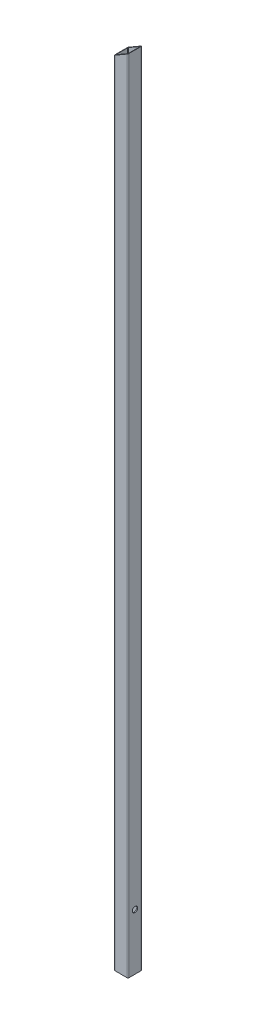
ISO-10303-21;
HEADER;
FILE_DESCRIPTION(('STEP AP214'),'2;1');
FILE_NAME('part.step','',(''),(''),'','','');
FILE_SCHEMA(('AUTOMOTIVE_DESIGN { 1 0 10303 214 1 1 1 1 }'));
ENDSEC;
DATA;
#1=APPLICATION_CONTEXT('core data for automotive mechanical design processes');
#2=APPLICATION_PROTOCOL_DEFINITION('international standard','automotive_design',2000,#1);
#3=PRODUCT_CONTEXT('',#1,'mechanical');
#4=PRODUCT('Part','Part','',(#3));
#5=PRODUCT_RELATED_PRODUCT_CATEGORY('part','',(#4));
#6=PRODUCT_DEFINITION_FORMATION('','',#4);
#7=PRODUCT_DEFINITION_CONTEXT('part definition',#1,'design');
#8=PRODUCT_DEFINITION('design','',#6,#7);
#9=PRODUCT_DEFINITION_SHAPE('','',#8);
#10=(LENGTH_UNIT() NAMED_UNIT(*) SI_UNIT(.MILLI.,.METRE.));
#11=(NAMED_UNIT(*) PLANE_ANGLE_UNIT() SI_UNIT($,.RADIAN.));
#12=(NAMED_UNIT(*) SI_UNIT($,.STERADIAN.) SOLID_ANGLE_UNIT());
#13=UNCERTAINTY_MEASURE_WITH_UNIT(LENGTH_MEASURE(1.E-05),#10,'distance_accuracy_value','');
#14=(GEOMETRIC_REPRESENTATION_CONTEXT(3) GLOBAL_UNCERTAINTY_ASSIGNED_CONTEXT((#13)) GLOBAL_UNIT_ASSIGNED_CONTEXT((#10,
#11,#12)) REPRESENTATION_CONTEXT('',''));
#15=CARTESIAN_POINT('',(0.,0.,0.));
#16=DIRECTION('',(0.,0.,1.));
#17=DIRECTION('',(1.,0.,0.));
#18=AXIS2_PLACEMENT_3D('',#15,#16,#17);
#19=CARTESIAN_POINT('',(-22.,-150.,22.));
#20=DIRECTION('',(0.,1.,0.));
#21=DIRECTION('',(0.,0.,1.));
#22=AXIS2_PLACEMENT_3D('',#19,#20,#21);
#23=CYLINDRICAL_SURFACE('',#22,3.);
#24=DIRECTION('',(0.,1.,0.));
#25=VECTOR('',#24,1.);
#26=CARTESIAN_POINT('',(-22.,-150.,25.));
#27=LINE('',#26,#25);
#28=CARTESIAN_POINT('',(-22.,-150.,25.));
#29=VERTEX_POINT('',#28);
#30=CARTESIAN_POINT('',(-22.,2678.15709287832,25.));
#31=VERTEX_POINT('',#30);
#32=EDGE_CURVE('E162',#29,#31,#27,.T.);
#33=ORIENTED_EDGE('',*,*,#32,.T.);
#34=CARTESIAN_POINT('',(-22.,2678.15709287832,22.));
#35=DIRECTION('',(0.5,-0.866025403784439,0.));
#36=DIRECTION('',(-0.866025403784439,-0.5,0.));
#37=AXIS2_PLACEMENT_3D('',#34,#35,#36);
#38=ELLIPSE('',#37,3.46410161513776,3.);
#39=CARTESIAN_POINT('',(-25.,2676.42504207075,22.));
#40=VERTEX_POINT('',#39);
#41=EDGE_CURVE('E172',#31,#40,#38,.T.);
#42=ORIENTED_EDGE('',*,*,#41,.T.);
#43=DIRECTION('',(0.,1.,0.));
#44=VECTOR('',#43,1.);
#45=CARTESIAN_POINT('',(-25.,-150.,22.));
#46=LINE('',#45,#44);
#47=CARTESIAN_POINT('',(-25.,-150.,22.));
#48=VERTEX_POINT('',#47);
#49=EDGE_CURVE('E11',#48,#40,#46,.T.);
#50=ORIENTED_EDGE('',*,*,#49,.F.);
#51=CARTESIAN_POINT('',(-22.,-150.,22.));
#52=DIRECTION('',(0.,1.,0.));
#53=DIRECTION('',(0.,0.,1.));
#54=AXIS2_PLACEMENT_3D('',#51,#52,#53);
#55=CIRCLE('',#54,3.);
#56=EDGE_CURVE('E263',#48,#29,#55,.T.);
#57=ORIENTED_EDGE('',*,*,#56,.T.);
#58=EDGE_LOOP('',(#33,#42,#50,#57));
#59=FACE_BOUND('',#58,.T.);
#60=ADVANCED_FACE('F36',(#59),#23,.T.);
#61=CARTESIAN_POINT('',(-25.,-150.,-22.));
#62=DIRECTION('',(-1.,0.,0.));
#63=DIRECTION('',(0.,0.,1.));
#64=AXIS2_PLACEMENT_3D('',#61,#62,#63);
#65=PLANE('',#64);
#66=CARTESIAN_POINT('',(-25.,50.,0.));
#67=DIRECTION('',(1.,0.,0.));
#68=DIRECTION('',(0.,0.,-1.));
#69=AXIS2_PLACEMENT_3D('',#66,#67,#68);
#70=CIRCLE('',#69,9.5);
#71=CARTESIAN_POINT('',(-25.,50.,-9.49999999999999));
#72=VERTEX_POINT('',#71);
#73=EDGE_CURVE('E418',#72,#72,#70,.T.);
#74=ORIENTED_EDGE('',*,*,#73,.T.);
#75=EDGE_LOOP('',(#74));
#76=FACE_BOUND('',#75,.T.);
#77=ORIENTED_EDGE('',*,*,#49,.T.);
#78=DIRECTION('',(0.,0.,-1.));
#79=VECTOR('',#78,1.);
#80=CARTESIAN_POINT('',(-25.,2676.42504207075,-22.));
#81=LINE('',#80,#79);
#82=CARTESIAN_POINT('',(-25.,2676.42504207075,-22.));
#83=VERTEX_POINT('',#82);
#84=EDGE_CURVE('E196',#40,#83,#81,.T.);
#85=ORIENTED_EDGE('',*,*,#84,.T.);
#86=DIRECTION('',(0.,1.,0.));
#87=VECTOR('',#86,1.);
#88=CARTESIAN_POINT('',(-25.,-150.,-22.));
#89=LINE('',#88,#87);
#90=CARTESIAN_POINT('',(-25.,-150.,-22.));
#91=VERTEX_POINT('',#90);
#92=EDGE_CURVE('E45',#91,#83,#89,.T.);
#93=ORIENTED_EDGE('',*,*,#92,.F.);
#94=DIRECTION('',(0.,0.,1.));
#95=VECTOR('',#94,1.);
#96=CARTESIAN_POINT('',(-25.,-150.,-22.));
#97=LINE('',#96,#95);
#98=EDGE_CURVE('E307',#91,#48,#97,.T.);
#99=ORIENTED_EDGE('',*,*,#98,.T.);
#100=EDGE_LOOP('',(#77,#85,#93,#99));
#101=FACE_BOUND('',#100,.T.);
#102=ADVANCED_FACE('F344',(#76,#101),#65,.T.);
#103=CARTESIAN_POINT('',(-22.,-150.,-22.));
#104=DIRECTION('',(0.,1.,0.));
#105=DIRECTION('',(0.,0.,1.));
#106=AXIS2_PLACEMENT_3D('',#103,#104,#105);
#107=CYLINDRICAL_SURFACE('',#106,3.);
#108=ORIENTED_EDGE('',*,*,#92,.T.);
#109=CARTESIAN_POINT('',(-22.,2678.15709287832,-22.));
#110=DIRECTION('',(0.5,-0.866025403784439,0.));
#111=DIRECTION('',(-0.866025403784439,-0.5,0.));
#112=AXIS2_PLACEMENT_3D('',#109,#110,#111);
#113=ELLIPSE('',#112,3.46410161513776,3.);
#114=CARTESIAN_POINT('',(-22.,2678.15709287832,-25.));
#115=VERTEX_POINT('',#114);
#116=EDGE_CURVE('E192',#83,#115,#113,.T.);
#117=ORIENTED_EDGE('',*,*,#116,.T.);
#118=DIRECTION('',(0.,1.,0.));
#119=VECTOR('',#118,1.);
#120=CARTESIAN_POINT('',(-22.,-150.,-25.));
#121=LINE('',#120,#119);
#122=CARTESIAN_POINT('',(-22.,-150.,-25.));
#123=VERTEX_POINT('',#122);
#124=EDGE_CURVE('E313',#123,#115,#121,.T.);
#125=ORIENTED_EDGE('',*,*,#124,.F.);
#126=CARTESIAN_POINT('',(-22.,-150.,-22.));
#127=DIRECTION('',(0.,1.,0.));
#128=DIRECTION('',(0.,0.,1.));
#129=AXIS2_PLACEMENT_3D('',#126,#127,#128);
#130=CIRCLE('',#129,3.);
#131=EDGE_CURVE('E303',#123,#91,#130,.T.);
#132=ORIENTED_EDGE('',*,*,#131,.T.);
#133=EDGE_LOOP('',(#108,#117,#125,#132));
#134=FACE_BOUND('',#133,.T.);
#135=ADVANCED_FACE('F341',(#134),#107,.T.);
#136=CARTESIAN_POINT('',(-22.,-150.,-25.));
#137=DIRECTION('',(0.,0.,-1.));
#138=DIRECTION('',(-1.,0.,0.));
#139=AXIS2_PLACEMENT_3D('',#136,#137,#138);
#140=PLANE('',#139);
#141=ORIENTED_EDGE('',*,*,#124,.T.);
#142=DIRECTION('',(0.866025403784439,0.5,0.));
#143=VECTOR('',#142,1.);
#144=CARTESIAN_POINT('',(16.4869804220583,2700.37756138529,-25.));
#145=LINE('',#144,#143);
#146=CARTESIAN_POINT('',(22.,2703.56050472266,-25.));
#147=VERTEX_POINT('',#146);
#148=EDGE_CURVE('E188',#115,#147,#145,.T.);
#149=ORIENTED_EDGE('',*,*,#148,.T.);
#150=DIRECTION('',(0.,1.,0.));
#151=VECTOR('',#150,1.);
#152=CARTESIAN_POINT('',(22.,-150.,-25.));
#153=LINE('',#152,#151);
#154=CARTESIAN_POINT('',(22.,-150.,-25.));
#155=VERTEX_POINT('',#154);
#156=EDGE_CURVE('E316',#155,#147,#153,.T.);
#157=ORIENTED_EDGE('',*,*,#156,.F.);
#158=DIRECTION('',(-1.,0.,0.));
#159=VECTOR('',#158,1.);
#160=CARTESIAN_POINT('',(-22.,-150.,-25.));
#161=LINE('',#160,#159);
#162=EDGE_CURVE('E299',#155,#123,#161,.T.);
#163=ORIENTED_EDGE('',*,*,#162,.T.);
#164=EDGE_LOOP('',(#141,#149,#157,#163));
#165=FACE_BOUND('',#164,.T.);
#166=ADVANCED_FACE('F338',(#165),#140,.T.);
#167=CARTESIAN_POINT('',(22.,-150.,-22.));
#168=DIRECTION('',(0.,1.,0.));
#169=DIRECTION('',(0.,0.,1.));
#170=AXIS2_PLACEMENT_3D('',#167,#168,#169);
#171=CYLINDRICAL_SURFACE('',#170,3.00000000000001);
#172=ORIENTED_EDGE('',*,*,#156,.T.);
#173=CARTESIAN_POINT('',(22.,2703.56050472266,-22.));
#174=DIRECTION('',(0.5,-0.866025403784439,0.));
#175=DIRECTION('',(-0.866025403784439,-0.5,0.));
#176=AXIS2_PLACEMENT_3D('',#173,#174,#175);
#177=ELLIPSE('',#176,3.46410161513776,3.00000000000001);
#178=CARTESIAN_POINT('',(25.,2705.29255553023,-22.));
#179=VERTEX_POINT('',#178);
#180=EDGE_CURVE('E181',#147,#179,#177,.T.);
#181=ORIENTED_EDGE('',*,*,#180,.T.);
#182=DIRECTION('',(0.,1.,0.));
#183=VECTOR('',#182,1.);
#184=CARTESIAN_POINT('',(25.,-150.,-22.));
#185=LINE('',#184,#183);
#186=CARTESIAN_POINT('',(25.,-150.,-22.));
#187=VERTEX_POINT('',#186);
#188=EDGE_CURVE('E319',#187,#179,#185,.T.);
#189=ORIENTED_EDGE('',*,*,#188,.F.);
#190=CARTESIAN_POINT('',(22.,-150.,-22.));
#191=DIRECTION('',(0.,1.,0.));
#192=DIRECTION('',(0.,0.,-1.));
#193=AXIS2_PLACEMENT_3D('',#190,#191,#192);
#194=CIRCLE('',#193,3.00000000000001);
#195=EDGE_CURVE('E295',#187,#155,#194,.T.);
#196=ORIENTED_EDGE('',*,*,#195,.T.);
#197=EDGE_LOOP('',(#172,#181,#189,#196));
#198=FACE_BOUND('',#197,.T.);
#199=ADVANCED_FACE('F336',(#198),#171,.T.);
#200=CARTESIAN_POINT('',(25.,-150.,-22.));
#201=DIRECTION('',(1.,0.,0.));
#202=DIRECTION('',(0.,0.,-1.));
#203=AXIS2_PLACEMENT_3D('',#200,#201,#202);
#204=PLANE('',#203);
#205=CARTESIAN_POINT('',(25.,50.,0.));
#206=DIRECTION('',(1.,0.,0.));
#207=DIRECTION('',(0.,0.,-1.));
#208=AXIS2_PLACEMENT_3D('',#205,#206,#207);
#209=CIRCLE('',#208,9.5);
#210=CARTESIAN_POINT('',(25.,50.,-9.49999999999999));
#211=VERTEX_POINT('',#210);
#212=EDGE_CURVE('E423',#211,#211,#209,.T.);
#213=ORIENTED_EDGE('',*,*,#212,.F.);
#214=EDGE_LOOP('',(#213));
#215=FACE_BOUND('',#214,.T.);
#216=ORIENTED_EDGE('',*,*,#188,.T.);
#217=DIRECTION('',(0.,0.,1.));
#218=VECTOR('',#217,1.);
#219=CARTESIAN_POINT('',(25.,2705.29255553023,-22.));
#220=LINE('',#219,#218);
#221=CARTESIAN_POINT('',(25.,2705.29255553023,22.));
#222=VERTEX_POINT('',#221);
#223=EDGE_CURVE('E177',#179,#222,#220,.T.);
#224=ORIENTED_EDGE('',*,*,#223,.T.);
#225=DIRECTION('',(0.,1.,0.));
#226=VECTOR('',#225,1.);
#227=CARTESIAN_POINT('',(25.,-150.,22.));
#228=LINE('',#227,#226);
#229=CARTESIAN_POINT('',(25.,-150.,22.));
#230=VERTEX_POINT('',#229);
#231=EDGE_CURVE('E161',#230,#222,#228,.T.);
#232=ORIENTED_EDGE('',*,*,#231,.F.);
#233=DIRECTION('',(0.,0.,-1.));
#234=VECTOR('',#233,1.);
#235=CARTESIAN_POINT('',(25.,-150.,-22.));
#236=LINE('',#235,#234);
#237=EDGE_CURVE('E291',#230,#187,#236,.T.);
#238=ORIENTED_EDGE('',*,*,#237,.T.);
#239=EDGE_LOOP('',(#216,#224,#232,#238));
#240=FACE_BOUND('',#239,.T.);
#241=ADVANCED_FACE('F332',(#215,#240),#204,.T.);
#242=CARTESIAN_POINT('',(22.,-150.,22.));
#243=DIRECTION('',(0.,1.,0.));
#244=DIRECTION('',(0.,0.,1.));
#245=AXIS2_PLACEMENT_3D('',#242,#243,#244);
#246=CYLINDRICAL_SURFACE('',#245,3.);
#247=ORIENTED_EDGE('',*,*,#231,.T.);
#248=CARTESIAN_POINT('',(22.,2703.56050472266,22.));
#249=DIRECTION('',(0.5,-0.866025403784439,0.));
#250=DIRECTION('',(-0.866025403784439,-0.5,0.));
#251=AXIS2_PLACEMENT_3D('',#248,#249,#250);
#252=ELLIPSE('',#251,3.46410161513775,3.);
#253=CARTESIAN_POINT('',(22.,2703.56050472266,25.));
#254=VERTEX_POINT('',#253);
#255=EDGE_CURVE('E169',#222,#254,#252,.T.);
#256=ORIENTED_EDGE('',*,*,#255,.T.);
#257=DIRECTION('',(0.,1.,0.));
#258=VECTOR('',#257,1.);
#259=CARTESIAN_POINT('',(22.,-150.,25.));
#260=LINE('',#259,#258);
#261=CARTESIAN_POINT('',(22.,-150.,25.));
#262=VERTEX_POINT('',#261);
#263=EDGE_CURVE('E150',#262,#254,#260,.T.);
#264=ORIENTED_EDGE('',*,*,#263,.F.);
#265=CARTESIAN_POINT('',(22.,-150.,22.));
#266=DIRECTION('',(0.,1.,0.));
#267=DIRECTION('',(0.,0.,1.));
#268=AXIS2_PLACEMENT_3D('',#265,#266,#267);
#269=CIRCLE('',#268,3.);
#270=EDGE_CURVE('E288',#262,#230,#269,.T.);
#271=ORIENTED_EDGE('',*,*,#270,.T.);
#272=EDGE_LOOP('',(#247,#256,#264,#271));
#273=FACE_BOUND('',#272,.T.);
#274=ADVANCED_FACE('F175',(#273),#246,.T.);
#275=CARTESIAN_POINT('',(-22.,-150.,25.));
#276=DIRECTION('',(0.,0.,1.));
#277=DIRECTION('',(1.,0.,0.));
#278=AXIS2_PLACEMENT_3D('',#275,#276,#277);
#279=PLANE('',#278);
#280=ORIENTED_EDGE('',*,*,#263,.T.);
#281=DIRECTION('',(-0.866025403784439,-0.5,0.));
#282=VECTOR('',#281,1.);
#283=CARTESIAN_POINT('',(16.4869804220583,2700.37756138529,25.));
#284=LINE('',#283,#282);
#285=EDGE_CURVE('E153',#254,#31,#284,.T.);
#286=ORIENTED_EDGE('',*,*,#285,.T.);
#287=ORIENTED_EDGE('',*,*,#32,.F.);
#288=DIRECTION('',(1.,0.,0.));
#289=VECTOR('',#288,1.);
#290=CARTESIAN_POINT('',(-22.,-150.,25.));
#291=LINE('',#290,#289);
#292=EDGE_CURVE('E155',#29,#262,#291,.T.);
#293=ORIENTED_EDGE('',*,*,#292,.T.);
#294=EDGE_LOOP('',(#280,#286,#287,#293));
#295=FACE_BOUND('',#294,.T.);
#296=ADVANCED_FACE('F152',(#295),#279,.T.);
#297=CARTESIAN_POINT('',(-22.,-150.,22.));
#298=DIRECTION('',(0.,1.,0.));
#299=DIRECTION('',(0.,0.,1.));
#300=AXIS2_PLACEMENT_3D('',#297,#298,#299);
#301=PLANE('',#300);
#302=DIRECTION('',(0.,0.,1.));
#303=VECTOR('',#302,1.);
#304=CARTESIAN_POINT('',(-22.,-150.,-20.));
#305=LINE('',#304,#303);
#306=CARTESIAN_POINT('',(-22.,-150.,-20.));
#307=VERTEX_POINT('',#306);
#308=CARTESIAN_POINT('',(-22.,-150.,20.));
#309=VERTEX_POINT('',#308);
#310=EDGE_CURVE('E255',#307,#309,#305,.T.);
#311=ORIENTED_EDGE('',*,*,#310,.T.);
#312=CARTESIAN_POINT('',(-20.,-150.,20.));
#313=DIRECTION('',(0.,1.,0.));
#314=DIRECTION('',(0.,0.,1.));
#315=AXIS2_PLACEMENT_3D('',#312,#313,#314);
#316=CIRCLE('',#315,2.);
#317=CARTESIAN_POINT('',(-20.,-150.,22.));
#318=VERTEX_POINT('',#317);
#319=EDGE_CURVE('E209',#309,#318,#316,.T.);
#320=ORIENTED_EDGE('',*,*,#319,.T.);
#321=DIRECTION('',(1.,0.,0.));
#322=VECTOR('',#321,1.);
#323=CARTESIAN_POINT('',(-20.,-150.,22.));
#324=LINE('',#323,#322);
#325=CARTESIAN_POINT('',(20.,-150.,22.));
#326=VERTEX_POINT('',#325);
#327=EDGE_CURVE('E233',#318,#326,#324,.T.);
#328=ORIENTED_EDGE('',*,*,#327,.T.);
#329=CARTESIAN_POINT('',(20.,-150.,20.));
#330=DIRECTION('',(0.,1.,0.));
#331=DIRECTION('',(0.,0.,1.));
#332=AXIS2_PLACEMENT_3D('',#329,#330,#331);
#333=CIRCLE('',#332,2.);
#334=CARTESIAN_POINT('',(22.,-150.,20.));
#335=VERTEX_POINT('',#334);
#336=EDGE_CURVE('E53',#326,#335,#333,.T.);
#337=ORIENTED_EDGE('',*,*,#336,.T.);
#338=DIRECTION('',(0.,0.,-1.));
#339=VECTOR('',#338,1.);
#340=CARTESIAN_POINT('',(22.,-150.,-20.));
#341=LINE('',#340,#339);
#342=CARTESIAN_POINT('',(22.,-150.,-20.));
#343=VERTEX_POINT('',#342);
#344=EDGE_CURVE('E239',#335,#343,#341,.T.);
#345=ORIENTED_EDGE('',*,*,#344,.T.);
#346=CARTESIAN_POINT('',(20.,-150.,-20.));
#347=DIRECTION('',(0.,1.,0.));
#348=DIRECTION('',(0.,0.,-1.));
#349=AXIS2_PLACEMENT_3D('',#346,#347,#348);
#350=CIRCLE('',#349,2.);
#351=CARTESIAN_POINT('',(20.,-150.,-22.));
#352=VERTEX_POINT('',#351);
#353=EDGE_CURVE('E243',#343,#352,#350,.T.);
#354=ORIENTED_EDGE('',*,*,#353,.T.);
#355=DIRECTION('',(-1.,0.,0.));
#356=VECTOR('',#355,1.);
#357=CARTESIAN_POINT('',(-20.,-150.,-22.));
#358=LINE('',#357,#356);
#359=CARTESIAN_POINT('',(-20.,-150.,-22.));
#360=VERTEX_POINT('',#359);
#361=EDGE_CURVE('E247',#352,#360,#358,.T.);
#362=ORIENTED_EDGE('',*,*,#361,.T.);
#363=CARTESIAN_POINT('',(-20.,-150.,-20.));
#364=DIRECTION('',(0.,1.,0.));
#365=DIRECTION('',(0.,0.,1.));
#366=AXIS2_PLACEMENT_3D('',#363,#364,#365);
#367=CIRCLE('',#366,2.);
#368=EDGE_CURVE('E251',#360,#307,#367,.T.);
#369=ORIENTED_EDGE('',*,*,#368,.T.);
#370=EDGE_LOOP('',(#311,#320,#328,#337,#345,#354,#362,#369));
#371=FACE_BOUND('',#370,.T.);
#372=ORIENTED_EDGE('',*,*,#56,.F.);
#373=ORIENTED_EDGE('',*,*,#98,.F.);
#374=ORIENTED_EDGE('',*,*,#131,.F.);
#375=ORIENTED_EDGE('',*,*,#162,.F.);
#376=ORIENTED_EDGE('',*,*,#195,.F.);
#377=ORIENTED_EDGE('',*,*,#237,.F.);
#378=ORIENTED_EDGE('',*,*,#270,.F.);
#379=ORIENTED_EDGE('',*,*,#292,.F.);
#380=EDGE_LOOP('',(#372,#373,#374,#375,#376,#377,#378,#379));
#381=FACE_BOUND('',#380,.T.);
#382=ADVANCED_FACE('F326',(#371,#381),#301,.F.);
#383=CARTESIAN_POINT('',(-20.,-150.,20.));
#384=DIRECTION('',(0.,1.,0.));
#385=DIRECTION('',(0.,0.,1.));
#386=AXIS2_PLACEMENT_3D('',#383,#384,#385);
#387=CYLINDRICAL_SURFACE('',#386,2.);
#388=DIRECTION('',(0.,1.,0.));
#389=VECTOR('',#388,1.);
#390=CARTESIAN_POINT('',(-22.,-150.,20.));
#391=LINE('',#390,#389);
#392=CARTESIAN_POINT('',(-22.,2678.15709287832,20.));
#393=VERTEX_POINT('',#392);
#394=EDGE_CURVE('E260',#309,#393,#391,.T.);
#395=ORIENTED_EDGE('',*,*,#394,.T.);
#396=CARTESIAN_POINT('',(-20.,2679.3117934167,20.));
#397=DIRECTION('',(0.5,-0.866025403784439,0.));
#398=DIRECTION('',(-0.866025403784439,-0.5,0.));
#399=AXIS2_PLACEMENT_3D('',#396,#397,#398);
#400=ELLIPSE('',#399,2.30940107675851,2.);
#401=CARTESIAN_POINT('',(-20.,2679.3117934167,22.));
#402=VERTEX_POINT('',#401);
#403=EDGE_CURVE('E200',#402,#393,#400,.T.);
#404=ORIENTED_EDGE('',*,*,#403,.F.);
#405=DIRECTION('',(0.,1.,0.));
#406=VECTOR('',#405,1.);
#407=CARTESIAN_POINT('',(-20.,-150.,22.));
#408=LINE('',#407,#406);
#409=EDGE_CURVE('E259',#318,#402,#408,.T.);
#410=ORIENTED_EDGE('',*,*,#409,.F.);
#411=ORIENTED_EDGE('',*,*,#319,.F.);
#412=EDGE_LOOP('',(#395,#404,#410,#411));
#413=FACE_BOUND('',#412,.T.);
#414=ADVANCED_FACE('F369',(#413),#387,.F.);
#415=CARTESIAN_POINT('',(-22.,-150.,-20.));
#416=DIRECTION('',(-1.,0.,0.));
#417=DIRECTION('',(0.,0.,1.));
#418=AXIS2_PLACEMENT_3D('',#415,#416,#417);
#419=PLANE('',#418);
#420=CARTESIAN_POINT('',(-22.,50.,0.));
#421=DIRECTION('',(-1.,0.,0.));
#422=DIRECTION('',(0.,0.,1.));
#423=AXIS2_PLACEMENT_3D('',#420,#421,#422);
#424=CIRCLE('',#423,9.5);
#425=CARTESIAN_POINT('',(-22.,50.,9.50000000000001));
#426=VERTEX_POINT('',#425);
#427=EDGE_CURVE('E407',#426,#426,#424,.T.);
#428=ORIENTED_EDGE('',*,*,#427,.T.);
#429=EDGE_LOOP('',(#428));
#430=FACE_BOUND('',#429,.T.);
#431=DIRECTION('',(0.,1.,0.));
#432=VECTOR('',#431,1.);
#433=CARTESIAN_POINT('',(-22.,-150.,-20.));
#434=LINE('',#433,#432);
#435=CARTESIAN_POINT('',(-22.,2678.15709287832,-20.));
#436=VERTEX_POINT('',#435);
#437=EDGE_CURVE('E264',#307,#436,#434,.T.);
#438=ORIENTED_EDGE('',*,*,#437,.T.);
#439=DIRECTION('',(0.,0.,-1.));
#440=VECTOR('',#439,1.);
#441=CARTESIAN_POINT('',(-22.,2678.15709287832,-20.));
#442=LINE('',#441,#440);
#443=EDGE_CURVE('E204',#393,#436,#442,.T.);
#444=ORIENTED_EDGE('',*,*,#443,.F.);
#445=ORIENTED_EDGE('',*,*,#394,.F.);
#446=ORIENTED_EDGE('',*,*,#310,.F.);
#447=EDGE_LOOP('',(#438,#444,#445,#446));
#448=FACE_BOUND('',#447,.T.);
#449=ADVANCED_FACE('F374',(#430,#448),#419,.F.);
#450=CARTESIAN_POINT('',(-20.,-150.,-20.));
#451=DIRECTION('',(0.,1.,0.));
#452=DIRECTION('',(0.,0.,1.));
#453=AXIS2_PLACEMENT_3D('',#450,#451,#452);
#454=CYLINDRICAL_SURFACE('',#453,2.);
#455=DIRECTION('',(0.,1.,0.));
#456=VECTOR('',#455,1.);
#457=CARTESIAN_POINT('',(-20.,-150.,-22.));
#458=LINE('',#457,#456);
#459=CARTESIAN_POINT('',(-20.,2679.3117934167,-22.));
#460=VERTEX_POINT('',#459);
#461=EDGE_CURVE('E267',#360,#460,#458,.T.);
#462=ORIENTED_EDGE('',*,*,#461,.T.);
#463=CARTESIAN_POINT('',(-20.,2679.3117934167,-20.));
#464=DIRECTION('',(0.5,-0.866025403784439,0.));
#465=DIRECTION('',(-0.866025403784439,-0.5,0.));
#466=AXIS2_PLACEMENT_3D('',#463,#464,#465);
#467=ELLIPSE('',#466,2.30940107675851,2.);
#468=EDGE_CURVE('E226',#436,#460,#467,.T.);
#469=ORIENTED_EDGE('',*,*,#468,.F.);
#470=ORIENTED_EDGE('',*,*,#437,.F.);
#471=ORIENTED_EDGE('',*,*,#368,.F.);
#472=EDGE_LOOP('',(#462,#469,#470,#471));
#473=FACE_BOUND('',#472,.T.);
#474=ADVANCED_FACE('F401',(#473),#454,.F.);
#475=CARTESIAN_POINT('',(-20.,-150.,-22.));
#476=DIRECTION('',(0.,0.,-1.));
#477=DIRECTION('',(-1.,0.,0.));
#478=AXIS2_PLACEMENT_3D('',#475,#476,#477);
#479=PLANE('',#478);
#480=DIRECTION('',(0.,1.,0.));
#481=VECTOR('',#480,1.);
#482=CARTESIAN_POINT('',(20.,-150.,-22.));
#483=LINE('',#482,#481);
#484=CARTESIAN_POINT('',(20.,2702.40580418428,-22.));
#485=VERTEX_POINT('',#484);
#486=EDGE_CURVE('E270',#352,#485,#483,.T.);
#487=ORIENTED_EDGE('',*,*,#486,.T.);
#488=DIRECTION('',(0.866025403784439,0.5,0.));
#489=VECTOR('',#488,1.);
#490=CARTESIAN_POINT('',(17.9869804220583,2701.24358678907,-22.));
#491=LINE('',#490,#489);
#492=EDGE_CURVE('E222',#460,#485,#491,.T.);
#493=ORIENTED_EDGE('',*,*,#492,.F.);
#494=ORIENTED_EDGE('',*,*,#461,.F.);
#495=ORIENTED_EDGE('',*,*,#361,.F.);
#496=EDGE_LOOP('',(#487,#493,#494,#495));
#497=FACE_BOUND('',#496,.T.);
#498=ADVANCED_FACE('F398',(#497),#479,.F.);
#499=CARTESIAN_POINT('',(20.,-150.,-20.));
#500=DIRECTION('',(0.,1.,0.));
#501=DIRECTION('',(0.,0.,1.));
#502=AXIS2_PLACEMENT_3D('',#499,#500,#501);
#503=CYLINDRICAL_SURFACE('',#502,2.);
#504=DIRECTION('',(0.,1.,0.));
#505=VECTOR('',#504,1.);
#506=CARTESIAN_POINT('',(22.,-150.,-20.));
#507=LINE('',#506,#505);
#508=CARTESIAN_POINT('',(22.,2703.56050472266,-20.));
#509=VERTEX_POINT('',#508);
#510=EDGE_CURVE('E273',#343,#509,#507,.T.);
#511=ORIENTED_EDGE('',*,*,#510,.T.);
#512=CARTESIAN_POINT('',(20.,2702.40580418428,-20.));
#513=DIRECTION('',(0.5,-0.866025403784439,0.));
#514=DIRECTION('',(-0.866025403784439,-0.5,0.));
#515=AXIS2_PLACEMENT_3D('',#512,#513,#514);
#516=ELLIPSE('',#515,2.30940107675851,2.);
#517=EDGE_CURVE('E218',#485,#509,#516,.T.);
#518=ORIENTED_EDGE('',*,*,#517,.F.);
#519=ORIENTED_EDGE('',*,*,#486,.F.);
#520=ORIENTED_EDGE('',*,*,#353,.F.);
#521=EDGE_LOOP('',(#511,#518,#519,#520));
#522=FACE_BOUND('',#521,.T.);
#523=ADVANCED_FACE('F394',(#522),#503,.F.);
#524=CARTESIAN_POINT('',(22.,-150.,-20.));
#525=DIRECTION('',(1.,0.,0.));
#526=DIRECTION('',(0.,0.,-1.));
#527=AXIS2_PLACEMENT_3D('',#524,#525,#526);
#528=PLANE('',#527);
#529=CARTESIAN_POINT('',(22.,50.,0.));
#530=DIRECTION('',(1.,0.,0.));
#531=DIRECTION('',(0.,0.,-1.));
#532=AXIS2_PLACEMENT_3D('',#529,#530,#531);
#533=CIRCLE('',#532,9.5);
#534=CARTESIAN_POINT('',(22.,50.,-9.49999999999999));
#535=VERTEX_POINT('',#534);
#536=EDGE_CURVE('E39',#535,#535,#533,.T.);
#537=ORIENTED_EDGE('',*,*,#536,.T.);
#538=EDGE_LOOP('',(#537));
#539=FACE_BOUND('',#538,.T.);
#540=DIRECTION('',(0.,1.,0.));
#541=VECTOR('',#540,1.);
#542=CARTESIAN_POINT('',(22.,-150.,20.));
#543=LINE('',#542,#541);
#544=CARTESIAN_POINT('',(22.,2703.56050472266,20.));
#545=VERTEX_POINT('',#544);
#546=EDGE_CURVE('E276',#335,#545,#543,.T.);
#547=ORIENTED_EDGE('',*,*,#546,.T.);
#548=DIRECTION('',(0.,0.,1.));
#549=VECTOR('',#548,1.);
#550=CARTESIAN_POINT('',(22.,2703.56050472266,-20.));
#551=LINE('',#550,#549);
#552=EDGE_CURVE('E214',#509,#545,#551,.T.);
#553=ORIENTED_EDGE('',*,*,#552,.F.);
#554=ORIENTED_EDGE('',*,*,#510,.F.);
#555=ORIENTED_EDGE('',*,*,#344,.F.);
#556=EDGE_LOOP('',(#547,#553,#554,#555));
#557=FACE_BOUND('',#556,.T.);
#558=ADVANCED_FACE('F390',(#539,#557),#528,.F.);
#559=CARTESIAN_POINT('',(20.,-150.,20.));
#560=DIRECTION('',(0.,1.,0.));
#561=DIRECTION('',(0.,0.,1.));
#562=AXIS2_PLACEMENT_3D('',#559,#560,#561);
#563=CYLINDRICAL_SURFACE('',#562,2.);
#564=DIRECTION('',(0.,1.,0.));
#565=VECTOR('',#564,1.);
#566=CARTESIAN_POINT('',(20.,-150.,22.));
#567=LINE('',#566,#565);
#568=CARTESIAN_POINT('',(20.,2702.40580418428,22.));
#569=VERTEX_POINT('',#568);
#570=EDGE_CURVE('E279',#326,#569,#567,.T.);
#571=ORIENTED_EDGE('',*,*,#570,.T.);
#572=CARTESIAN_POINT('',(20.,2702.40580418428,20.));
#573=DIRECTION('',(0.5,-0.866025403784439,0.));
#574=DIRECTION('',(-0.866025403784439,-0.5,0.));
#575=AXIS2_PLACEMENT_3D('',#572,#573,#574);
#576=ELLIPSE('',#575,2.30940107675851,2.);
#577=EDGE_CURVE('E210',#545,#569,#576,.T.);
#578=ORIENTED_EDGE('',*,*,#577,.F.);
#579=ORIENTED_EDGE('',*,*,#546,.F.);
#580=ORIENTED_EDGE('',*,*,#336,.F.);
#581=EDGE_LOOP('',(#571,#578,#579,#580));
#582=FACE_BOUND('',#581,.T.);
#583=ADVANCED_FACE('F454',(#582),#563,.F.);
#584=CARTESIAN_POINT('',(-20.,-150.,22.));
#585=DIRECTION('',(0.,0.,1.));
#586=DIRECTION('',(1.,0.,0.));
#587=AXIS2_PLACEMENT_3D('',#584,#585,#586);
#588=PLANE('',#587);
#589=ORIENTED_EDGE('',*,*,#409,.T.);
#590=DIRECTION('',(-0.866025403784439,-0.5,0.));
#591=VECTOR('',#590,1.);
#592=CARTESIAN_POINT('',(17.9869804220583,2701.24358678907,22.));
#593=LINE('',#592,#591);
#594=EDGE_CURVE('E205',#569,#402,#593,.T.);
#595=ORIENTED_EDGE('',*,*,#594,.F.);
#596=ORIENTED_EDGE('',*,*,#570,.F.);
#597=ORIENTED_EDGE('',*,*,#327,.F.);
#598=EDGE_LOOP('',(#589,#595,#596,#597));
#599=FACE_BOUND('',#598,.T.);
#600=ADVANCED_FACE('F386',(#599),#588,.F.);
#601=CARTESIAN_POINT('',(532.5,2998.29781714396,22.0000000000005));
#602=DIRECTION('',(0.5,-0.866025403784439,0.));
#603=DIRECTION('',(0.,0.,1.));
#604=AXIS2_PLACEMENT_3D('',#601,#602,#603);
#605=PLANE('',#604);
#606=ORIENTED_EDGE('',*,*,#403,.T.);
#607=ORIENTED_EDGE('',*,*,#443,.T.);
#608=ORIENTED_EDGE('',*,*,#468,.T.);
#609=ORIENTED_EDGE('',*,*,#492,.T.);
#610=ORIENTED_EDGE('',*,*,#517,.T.);
#611=ORIENTED_EDGE('',*,*,#552,.T.);
#612=ORIENTED_EDGE('',*,*,#577,.T.);
#613=ORIENTED_EDGE('',*,*,#594,.T.);
#614=EDGE_LOOP('',(#606,#607,#608,#609,#610,#611,#612,#613));
#615=FACE_BOUND('',#614,.T.);
#616=ORIENTED_EDGE('',*,*,#285,.F.);
#617=ORIENTED_EDGE('',*,*,#255,.F.);
#618=ORIENTED_EDGE('',*,*,#223,.F.);
#619=ORIENTED_EDGE('',*,*,#180,.F.);
#620=ORIENTED_EDGE('',*,*,#148,.F.);
#621=ORIENTED_EDGE('',*,*,#116,.F.);
#622=ORIENTED_EDGE('',*,*,#84,.F.);
#623=ORIENTED_EDGE('',*,*,#41,.F.);
#624=EDGE_LOOP('',(#616,#617,#618,#619,#620,#621,#622,#623));
#625=FACE_BOUND('',#624,.T.);
#626=ADVANCED_FACE('F167',(#615,#625),#605,.F.);
#627=CARTESIAN_POINT('',(-25.,50.,0.));
#628=DIRECTION('',(1.,0.,0.));
#629=DIRECTION('',(0.,0.,-1.));
#630=AXIS2_PLACEMENT_3D('',#627,#628,#629);
#631=CYLINDRICAL_SURFACE('',#630,9.5);
#632=ORIENTED_EDGE('',*,*,#212,.T.);
#633=EDGE_LOOP('',(#632));
#634=FACE_BOUND('',#633,.T.);
#635=ORIENTED_EDGE('',*,*,#536,.F.);
#636=EDGE_LOOP('',(#635));
#637=FACE_BOUND('',#636,.T.);
#638=ADVANCED_FACE('F432',(#634,#637),#631,.F.);
#639=ORIENTED_EDGE('',*,*,#73,.F.);
#640=EDGE_LOOP('',(#639));
#641=FACE_BOUND('',#640,.T.);
#642=ORIENTED_EDGE('',*,*,#427,.F.);
#643=EDGE_LOOP('',(#642));
#644=FACE_BOUND('',#643,.T.);
#645=ADVANCED_FACE('F435',(#641,#644),#631,.F.);
#646=CLOSED_SHELL('',(#60,#102,#135,#166,#199,#241,#274,#296,#382,#414,#449,#474,#498,#523,#558,
#583,#600,#626,#638,#645));
#647=MANIFOLD_SOLID_BREP('B2',#646);
#648=ADVANCED_BREP_SHAPE_REPRESENTATION('',(#18,#647),#14);
#649=SHAPE_DEFINITION_REPRESENTATION(#9,#648);
ENDSEC;
END-ISO-10303-21;
